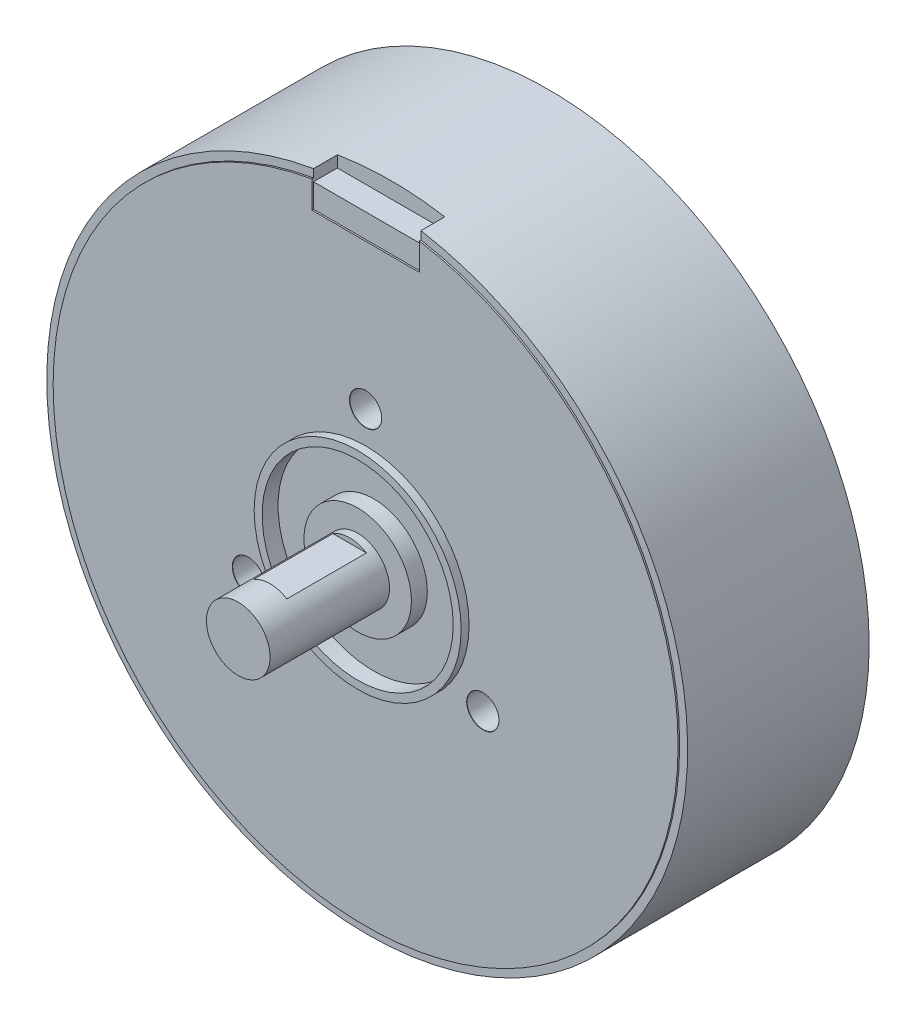
ISO-10303-21;
HEADER;
FILE_DESCRIPTION(('STEP AP214'),'2;1');
FILE_NAME('part.step','',(''),(''),'','','');
FILE_SCHEMA(('AUTOMOTIVE_DESIGN { 1 0 10303 214 1 1 1 1 }'));
ENDSEC;
DATA;
#1=APPLICATION_CONTEXT('core data for automotive mechanical design processes');
#2=APPLICATION_PROTOCOL_DEFINITION('international standard','automotive_design',2000,#1);
#3=PRODUCT_CONTEXT('',#1,'mechanical');
#4=PRODUCT('Part','Part','',(#3));
#5=PRODUCT_RELATED_PRODUCT_CATEGORY('part','',(#4));
#6=PRODUCT_DEFINITION_FORMATION('','',#4);
#7=PRODUCT_DEFINITION_CONTEXT('part definition',#1,'design');
#8=PRODUCT_DEFINITION('design','',#6,#7);
#9=PRODUCT_DEFINITION_SHAPE('','',#8);
#10=(LENGTH_UNIT() NAMED_UNIT(*) SI_UNIT(.MILLI.,.METRE.));
#11=(NAMED_UNIT(*) PLANE_ANGLE_UNIT() SI_UNIT($,.RADIAN.));
#12=(NAMED_UNIT(*) SI_UNIT($,.STERADIAN.) SOLID_ANGLE_UNIT());
#13=UNCERTAINTY_MEASURE_WITH_UNIT(LENGTH_MEASURE(1.E-05),#10,'distance_accuracy_value','');
#14=(GEOMETRIC_REPRESENTATION_CONTEXT(3) GLOBAL_UNCERTAINTY_ASSIGNED_CONTEXT((#13)) GLOBAL_UNIT_ASSIGNED_CONTEXT((#10,
#11,#12)) REPRESENTATION_CONTEXT('',''));
#15=CARTESIAN_POINT('',(0.,0.,0.));
#16=DIRECTION('',(0.,0.,1.));
#17=DIRECTION('',(1.,0.,0.));
#18=AXIS2_PLACEMENT_3D('',#15,#16,#17);
#19=CARTESIAN_POINT('',(0.,0.,22.8));
#20=DIRECTION('',(0.,0.,1.));
#21=DIRECTION('',(1.,0.,0.));
#22=AXIS2_PLACEMENT_3D('',#19,#20,#21);
#23=PLANE('',#22);
#24=CARTESIAN_POINT('',(0.,0.,22.8));
#25=DIRECTION('',(0.,0.,1.));
#26=DIRECTION('',(1.,0.,0.));
#27=AXIS2_PLACEMENT_3D('',#24,#25,#26);
#28=CIRCLE('',#27,39.25);
#29=CARTESIAN_POINT('',(-6.75,38.6652298583624,22.8));
#30=VERTEX_POINT('',#29);
#31=CARTESIAN_POINT('',(6.75,38.6652298583624,22.8));
#32=VERTEX_POINT('',#31);
#33=EDGE_CURVE('E242',#30,#32,#28,.T.);
#34=ORIENTED_EDGE('',*,*,#33,.F.);
#35=DIRECTION('',(0.,1.,0.));
#36=VECTOR('',#35,1.);
#37=CARTESIAN_POINT('',(-6.75,0.,22.8));
#38=LINE('',#37,#36);
#39=CARTESIAN_POINT('',(-6.75,39.679969758053,22.8));
#40=VERTEX_POINT('',#39);
#41=EDGE_CURVE('E208',#30,#40,#38,.T.);
#42=ORIENTED_EDGE('',*,*,#41,.T.);
#43=CARTESIAN_POINT('',(0.,0.,22.8));
#44=DIRECTION('',(0.,0.,1.));
#45=DIRECTION('',(1.,0.,0.));
#46=AXIS2_PLACEMENT_3D('',#43,#44,#45);
#47=CIRCLE('',#46,40.25);
#48=CARTESIAN_POINT('',(6.75,39.679969758053,22.8));
#49=VERTEX_POINT('',#48);
#50=EDGE_CURVE('E245',#40,#49,#47,.T.);
#51=ORIENTED_EDGE('',*,*,#50,.T.);
#52=DIRECTION('',(0.,1.,0.));
#53=VECTOR('',#52,1.);
#54=CARTESIAN_POINT('',(6.75,0.,22.8));
#55=LINE('',#54,#53);
#56=EDGE_CURVE('E197',#32,#49,#55,.T.);
#57=ORIENTED_EDGE('',*,*,#56,.F.);
#58=EDGE_LOOP('',(#34,#42,#51,#57));
#59=FACE_BOUND('',#58,.T.);
#60=ADVANCED_FACE('F66',(#59),#23,.T.);
#61=DIRECTION('',(0.,1.,0.));
#62=VECTOR('',#61,1.);
#63=CARTESIAN_POINT('',(6.75,0.,22.8));
#64=LINE('',#63,#62);
#65=CARTESIAN_POINT('',(6.75,35.25,22.8));
#66=VERTEX_POINT('',#65);
#67=CARTESIAN_POINT('',(6.75,38.25,22.8));
#68=VERTEX_POINT('',#67);
#69=EDGE_CURVE('E219',#66,#68,#64,.T.);
#70=ORIENTED_EDGE('',*,*,#69,.T.);
#71=DIRECTION('',(-1.,0.,0.));
#72=VECTOR('',#71,1.);
#73=CARTESIAN_POINT('',(0.,38.25,22.8));
#74=LINE('',#73,#72);
#75=CARTESIAN_POINT('',(-6.75,38.25,22.8));
#76=VERTEX_POINT('',#75);
#77=EDGE_CURVE('E81',#68,#76,#74,.T.);
#78=ORIENTED_EDGE('',*,*,#77,.T.);
#79=DIRECTION('',(0.,1.,0.));
#80=VECTOR('',#79,1.);
#81=CARTESIAN_POINT('',(-6.75,0.,22.8));
#82=LINE('',#81,#80);
#83=CARTESIAN_POINT('',(-6.75,35.25,22.8));
#84=VERTEX_POINT('',#83);
#85=EDGE_CURVE('E223',#84,#76,#82,.T.);
#86=ORIENTED_EDGE('',*,*,#85,.F.);
#87=DIRECTION('',(1.,0.,0.));
#88=VECTOR('',#87,1.);
#89=CARTESIAN_POINT('',(0.,35.25,22.8));
#90=LINE('',#89,#88);
#91=EDGE_CURVE('E216',#84,#66,#90,.T.);
#92=ORIENTED_EDGE('',*,*,#91,.T.);
#93=EDGE_LOOP('',(#70,#78,#86,#92));
#94=FACE_BOUND('',#93,.T.);
#95=ADVANCED_FACE('F329',(#94),#23,.T.);
#96=CARTESIAN_POINT('',(0.,0.,23.));
#97=DIRECTION('',(0.,0.,-1.));
#98=DIRECTION('',(-1.,0.,0.));
#99=AXIS2_PLACEMENT_3D('',#96,#97,#98);
#100=CYLINDRICAL_SURFACE('',#99,40.25);
#101=CARTESIAN_POINT('',(0.,0.,0.));
#102=DIRECTION('',(0.,0.,1.));
#103=DIRECTION('',(1.,0.,0.));
#104=AXIS2_PLACEMENT_3D('',#101,#102,#103);
#105=CIRCLE('',#104,40.25);
#106=CARTESIAN_POINT('',(40.25,0.,0.));
#107=VERTEX_POINT('',#106);
#108=EDGE_CURVE('E281',#107,#107,#105,.T.);
#109=ORIENTED_EDGE('',*,*,#108,.T.);
#110=EDGE_LOOP('',(#109));
#111=FACE_BOUND('',#110,.T.);
#112=CARTESIAN_POINT('',(0.,0.,19.8));
#113=DIRECTION('',(0.,0.,1.));
#114=DIRECTION('',(1.,0.,0.));
#115=AXIS2_PLACEMENT_3D('',#112,#113,#114);
#116=CIRCLE('',#115,40.25);
#117=CARTESIAN_POINT('',(6.75,39.679969758053,19.8));
#118=VERTEX_POINT('',#117);
#119=CARTESIAN_POINT('',(-6.75,39.679969758053,19.8));
#120=VERTEX_POINT('',#119);
#121=EDGE_CURVE('E305',#118,#120,#116,.T.);
#122=ORIENTED_EDGE('',*,*,#121,.F.);
#123=DIRECTION('',(0.,0.,-1.));
#124=VECTOR('',#123,1.);
#125=CARTESIAN_POINT('',(6.75,39.679969758053,23.));
#126=LINE('',#125,#124);
#127=EDGE_CURVE('E12',#118,#49,#126,.F.);
#128=ORIENTED_EDGE('',*,*,#127,.T.);
#129=ORIENTED_EDGE('',*,*,#50,.F.);
#130=DIRECTION('',(0.,0.,-1.));
#131=VECTOR('',#130,1.);
#132=CARTESIAN_POINT('',(-6.75,39.679969758053,23.));
#133=LINE('',#132,#131);
#134=EDGE_CURVE('E74',#120,#40,#133,.F.);
#135=ORIENTED_EDGE('',*,*,#134,.F.);
#136=EDGE_LOOP('',(#122,#128,#129,#135));
#137=FACE_BOUND('',#136,.T.);
#138=ADVANCED_FACE('F68',(#111,#137),#100,.T.);
#139=CARTESIAN_POINT('',(0.,0.,23.));
#140=DIRECTION('',(0.,0.,1.));
#141=DIRECTION('',(1.,0.,0.));
#142=AXIS2_PLACEMENT_3D('',#139,#140,#141);
#143=PLANE('',#142);
#144=CARTESIAN_POINT('',(0.,17.,23.));
#145=DIRECTION('',(0.,0.,1.));
#146=DIRECTION('',(1.,0.,0.));
#147=AXIS2_PLACEMENT_3D('',#144,#145,#146);
#148=CIRCLE('',#147,2.025);
#149=CARTESIAN_POINT('',(2.025,17.,23.));
#150=VERTEX_POINT('',#149);
#151=EDGE_CURVE('E179',#150,#150,#148,.T.);
#152=ORIENTED_EDGE('',*,*,#151,.F.);
#153=EDGE_LOOP('',(#152));
#154=FACE_BOUND('',#153,.T.);
#155=CARTESIAN_POINT('',(14.7224318643355,-8.49999999999996,23.));
#156=DIRECTION('',(0.,0.,1.));
#157=DIRECTION('',(1.,0.,0.));
#158=AXIS2_PLACEMENT_3D('',#155,#156,#157);
#159=CIRCLE('',#158,2.025);
#160=CARTESIAN_POINT('',(16.7474318643355,-8.49999999999996,23.));
#161=VERTEX_POINT('',#160);
#162=EDGE_CURVE('E172',#161,#161,#159,.T.);
#163=ORIENTED_EDGE('',*,*,#162,.F.);
#164=EDGE_LOOP('',(#163));
#165=FACE_BOUND('',#164,.T.);
#166=CARTESIAN_POINT('',(-14.7224318643355,-8.49999999999997,23.));
#167=DIRECTION('',(0.,0.,1.));
#168=DIRECTION('',(1.,0.,0.));
#169=AXIS2_PLACEMENT_3D('',#166,#167,#168);
#170=CIRCLE('',#169,2.025);
#171=CARTESIAN_POINT('',(-12.6974318643355,-8.49999999999997,23.));
#172=VERTEX_POINT('',#171);
#173=EDGE_CURVE('E188',#172,#172,#170,.T.);
#174=ORIENTED_EDGE('',*,*,#173,.F.);
#175=EDGE_LOOP('',(#174));
#176=FACE_BOUND('',#175,.T.);
#177=CARTESIAN_POINT('',(0.,0.,23.));
#178=DIRECTION('',(0.,0.,1.));
#179=DIRECTION('',(1.,0.,0.));
#180=AXIS2_PLACEMENT_3D('',#177,#178,#179);
#181=CIRCLE('',#180,13.);
#182=CARTESIAN_POINT('',(13.,0.,23.));
#183=VERTEX_POINT('',#182);
#184=EDGE_CURVE('E290',#183,#183,#181,.T.);
#185=ORIENTED_EDGE('',*,*,#184,.F.);
#186=EDGE_LOOP('',(#185));
#187=FACE_BOUND('',#186,.T.);
#188=DIRECTION('',(1.,0.,0.));
#189=VECTOR('',#188,1.);
#190=CARTESIAN_POINT('',(0.,35.25,23.));
#191=LINE('',#190,#189);
#192=CARTESIAN_POINT('',(-6.75,35.25,23.));
#193=VERTEX_POINT('',#192);
#194=CARTESIAN_POINT('',(6.75,35.25,23.));
#195=VERTEX_POINT('',#194);
#196=EDGE_CURVE('E214',#193,#195,#191,.T.);
#197=ORIENTED_EDGE('',*,*,#196,.F.);
#198=DIRECTION('',(0.,1.,0.));
#199=VECTOR('',#198,1.);
#200=CARTESIAN_POINT('',(-6.75,0.,23.));
#201=LINE('',#200,#199);
#202=CARTESIAN_POINT('',(-6.75,38.6652298583624,23.));
#203=VERTEX_POINT('',#202);
#204=EDGE_CURVE('E220',#193,#203,#201,.T.);
#205=ORIENTED_EDGE('',*,*,#204,.T.);
#206=CARTESIAN_POINT('',(0.,0.,23.));
#207=DIRECTION('',(0.,0.,1.));
#208=DIRECTION('',(1.,0.,0.));
#209=AXIS2_PLACEMENT_3D('',#206,#207,#208);
#210=CIRCLE('',#209,39.25);
#211=CARTESIAN_POINT('',(6.75,38.6652298583624,23.));
#212=VERTEX_POINT('',#211);
#213=EDGE_CURVE('E235',#203,#212,#210,.T.);
#214=ORIENTED_EDGE('',*,*,#213,.T.);
#215=DIRECTION('',(0.,1.,0.));
#216=VECTOR('',#215,1.);
#217=CARTESIAN_POINT('',(6.75,0.,23.));
#218=LINE('',#217,#216);
#219=EDGE_CURVE('E229',#195,#212,#218,.T.);
#220=ORIENTED_EDGE('',*,*,#219,.F.);
#221=EDGE_LOOP('',(#197,#205,#214,#220));
#222=FACE_BOUND('',#221,.T.);
#223=ADVANCED_FACE('F339',(#154,#165,#176,#187,#222),#143,.T.);
#224=CARTESIAN_POINT('',(0.,0.,22.8));
#225=DIRECTION('',(0.,0.,1.));
#226=DIRECTION('',(1.,0.,0.));
#227=AXIS2_PLACEMENT_3D('',#224,#225,#226);
#228=CYLINDRICAL_SURFACE('',#227,39.25);
#229=ORIENTED_EDGE('',*,*,#213,.F.);
#230=DIRECTION('',(0.,0.,1.));
#231=VECTOR('',#230,1.);
#232=CARTESIAN_POINT('',(-6.75,38.6652298583624,22.8));
#233=LINE('',#232,#231);
#234=EDGE_CURVE('E236',#30,#203,#233,.T.);
#235=ORIENTED_EDGE('',*,*,#234,.F.);
#236=ORIENTED_EDGE('',*,*,#33,.T.);
#237=DIRECTION('',(0.,0.,1.));
#238=VECTOR('',#237,1.);
#239=CARTESIAN_POINT('',(6.75,38.6652298583624,22.8));
#240=LINE('',#239,#238);
#241=EDGE_CURVE('E238',#32,#212,#240,.T.);
#242=ORIENTED_EDGE('',*,*,#241,.T.);
#243=EDGE_LOOP('',(#229,#235,#236,#242));
#244=FACE_BOUND('',#243,.T.);
#245=ADVANCED_FACE('F338',(#244),#228,.T.);
#246=CARTESIAN_POINT('',(0.,0.,25.));
#247=DIRECTION('',(0.,0.,1.));
#248=DIRECTION('',(1.,0.,0.));
#249=AXIS2_PLACEMENT_3D('',#246,#247,#248);
#250=PLANE('',#249);
#251=CARTESIAN_POINT('',(0.,0.,25.));
#252=DIRECTION('',(0.,0.,1.));
#253=DIRECTION('',(1.,0.,0.));
#254=AXIS2_PLACEMENT_3D('',#251,#252,#253);
#255=CIRCLE('',#254,4.);
#256=CARTESIAN_POINT('',(-3.4,2.10713075057055,25.));
#257=VERTEX_POINT('',#256);
#258=CARTESIAN_POINT('',(-3.4,-2.10713075057055,25.));
#259=VERTEX_POINT('',#258);
#260=EDGE_CURVE('E272',#257,#259,#255,.T.);
#261=ORIENTED_EDGE('',*,*,#260,.T.);
#262=DIRECTION('',(0.,1.,0.));
#263=VECTOR('',#262,1.);
#264=CARTESIAN_POINT('',(-3.4,0.,25.));
#265=LINE('',#264,#263);
#266=EDGE_CURVE('E302',#259,#257,#265,.T.);
#267=ORIENTED_EDGE('',*,*,#266,.T.);
#268=EDGE_LOOP('',(#261,#267));
#269=FACE_BOUND('',#268,.T.);
#270=ADVANCED_FACE('F347',(#269),#250,.T.);
#271=CARTESIAN_POINT('',(2.10713075057055,3.4,25.));
#272=VERTEX_POINT('',#271);
#273=CARTESIAN_POINT('',(-2.10713075057055,3.4,25.));
#274=VERTEX_POINT('',#273);
#275=EDGE_CURVE('E273',#272,#274,#255,.T.);
#276=ORIENTED_EDGE('',*,*,#275,.T.);
#277=DIRECTION('',(1.,0.,0.));
#278=VECTOR('',#277,1.);
#279=CARTESIAN_POINT('',(0.,3.4,25.));
#280=LINE('',#279,#278);
#281=EDGE_CURVE('E280',#274,#272,#280,.T.);
#282=ORIENTED_EDGE('',*,*,#281,.T.);
#283=EDGE_LOOP('',(#276,#282));
#284=FACE_BOUND('',#283,.T.);
#285=ADVANCED_FACE('F381',(#284),#250,.T.);
#286=CARTESIAN_POINT('',(0.,0.,24.));
#287=DIRECTION('',(0.,0.,1.));
#288=DIRECTION('',(1.,0.,0.));
#289=AXIS2_PLACEMENT_3D('',#286,#287,#288);
#290=PLANE('',#289);
#291=CARTESIAN_POINT('',(0.,0.,24.));
#292=DIRECTION('',(0.,0.,1.));
#293=DIRECTION('',(1.,0.,0.));
#294=AXIS2_PLACEMENT_3D('',#291,#292,#293);
#295=CIRCLE('',#294,13.);
#296=CARTESIAN_POINT('',(13.,0.,24.));
#297=VERTEX_POINT('',#296);
#298=EDGE_CURVE('E291',#297,#297,#295,.T.);
#299=ORIENTED_EDGE('',*,*,#298,.T.);
#300=EDGE_LOOP('',(#299));
#301=FACE_BOUND('',#300,.T.);
#302=CARTESIAN_POINT('',(0.,0.,24.));
#303=DIRECTION('',(0.,0.,1.));
#304=DIRECTION('',(1.,0.,0.));
#305=AXIS2_PLACEMENT_3D('',#302,#303,#304);
#306=CIRCLE('',#305,12.);
#307=CARTESIAN_POINT('',(12.,0.,24.));
#308=VERTEX_POINT('',#307);
#309=EDGE_CURVE('E285',#308,#308,#306,.T.);
#310=ORIENTED_EDGE('',*,*,#309,.F.);
#311=EDGE_LOOP('',(#310));
#312=FACE_BOUND('',#311,.T.);
#313=ADVANCED_FACE('F395',(#301,#312),#290,.T.);
#314=CARTESIAN_POINT('',(0.,0.,24.));
#315=DIRECTION('',(0.,0.,-1.));
#316=DIRECTION('',(-1.,0.,0.));
#317=AXIS2_PLACEMENT_3D('',#314,#315,#316);
#318=CYLINDRICAL_SURFACE('',#317,13.);
#319=ORIENTED_EDGE('',*,*,#298,.F.);
#320=EDGE_LOOP('',(#319));
#321=FACE_BOUND('',#320,.T.);
#322=ORIENTED_EDGE('',*,*,#184,.T.);
#323=EDGE_LOOP('',(#322));
#324=FACE_BOUND('',#323,.T.);
#325=ADVANCED_FACE('F398',(#321,#324),#318,.T.);
#326=CARTESIAN_POINT('',(0.,0.,22.));
#327=DIRECTION('',(0.,0.,1.));
#328=DIRECTION('',(1.,0.,0.));
#329=AXIS2_PLACEMENT_3D('',#326,#327,#328);
#330=PLANE('',#329);
#331=CARTESIAN_POINT('',(0.,0.,22.));
#332=DIRECTION('',(0.,0.,1.));
#333=DIRECTION('',(1.,0.,0.));
#334=AXIS2_PLACEMENT_3D('',#331,#332,#333);
#335=CIRCLE('',#334,6.75);
#336=CARTESIAN_POINT('',(6.75,0.,22.));
#337=VERTEX_POINT('',#336);
#338=EDGE_CURVE('E276',#337,#337,#335,.T.);
#339=ORIENTED_EDGE('',*,*,#338,.F.);
#340=EDGE_LOOP('',(#339));
#341=FACE_BOUND('',#340,.T.);
#342=CARTESIAN_POINT('',(0.,0.,22.));
#343=DIRECTION('',(0.,0.,1.));
#344=DIRECTION('',(1.,0.,0.));
#345=AXIS2_PLACEMENT_3D('',#342,#343,#344);
#346=CIRCLE('',#345,12.);
#347=CARTESIAN_POINT('',(12.,0.,22.));
#348=VERTEX_POINT('',#347);
#349=EDGE_CURVE('E294',#348,#348,#346,.T.);
#350=ORIENTED_EDGE('',*,*,#349,.T.);
#351=EDGE_LOOP('',(#350));
#352=FACE_BOUND('',#351,.T.);
#353=ADVANCED_FACE('F402',(#341,#352),#330,.T.);
#354=CARTESIAN_POINT('',(0.,0.,22.));
#355=DIRECTION('',(0.,0.,1.));
#356=DIRECTION('',(1.,0.,0.));
#357=AXIS2_PLACEMENT_3D('',#354,#355,#356);
#358=CYLINDRICAL_SURFACE('',#357,12.);
#359=ORIENTED_EDGE('',*,*,#349,.F.);
#360=EDGE_LOOP('',(#359));
#361=FACE_BOUND('',#360,.T.);
#362=ORIENTED_EDGE('',*,*,#309,.T.);
#363=EDGE_LOOP('',(#362));
#364=FACE_BOUND('',#363,.T.);
#365=ADVANCED_FACE('F393',(#361,#364),#358,.F.);
#366=CARTESIAN_POINT('',(0.,0.,24.));
#367=DIRECTION('',(0.,0.,-1.));
#368=DIRECTION('',(-1.,0.,0.));
#369=AXIS2_PLACEMENT_3D('',#366,#367,#368);
#370=CYLINDRICAL_SURFACE('',#369,6.75);
#371=CARTESIAN_POINT('',(0.,0.,24.));
#372=DIRECTION('',(0.,0.,1.));
#373=DIRECTION('',(1.,0.,0.));
#374=AXIS2_PLACEMENT_3D('',#371,#372,#373);
#375=CIRCLE('',#374,6.75);
#376=CARTESIAN_POINT('',(6.75,0.,24.));
#377=VERTEX_POINT('',#376);
#378=EDGE_CURVE('E282',#377,#377,#375,.T.);
#379=ORIENTED_EDGE('',*,*,#378,.F.);
#380=EDGE_LOOP('',(#379));
#381=FACE_BOUND('',#380,.T.);
#382=ORIENTED_EDGE('',*,*,#338,.T.);
#383=EDGE_LOOP('',(#382));
#384=FACE_BOUND('',#383,.T.);
#385=ADVANCED_FACE('F389',(#381,#384),#370,.T.);
#386=CARTESIAN_POINT('',(0.,0.,24.));
#387=DIRECTION('',(0.,0.,1.));
#388=DIRECTION('',(1.,0.,0.));
#389=AXIS2_PLACEMENT_3D('',#386,#387,#388);
#390=PLANE('',#389);
#391=CARTESIAN_POINT('',(0.,0.,24.));
#392=DIRECTION('',(0.,0.,1.));
#393=DIRECTION('',(1.,0.,0.));
#394=AXIS2_PLACEMENT_3D('',#391,#392,#393);
#395=CIRCLE('',#394,4.);
#396=CARTESIAN_POINT('',(4.,0.,24.));
#397=VERTEX_POINT('',#396);
#398=EDGE_CURVE('E277',#397,#397,#395,.T.);
#399=ORIENTED_EDGE('',*,*,#398,.F.);
#400=EDGE_LOOP('',(#399));
#401=FACE_BOUND('',#400,.T.);
#402=ORIENTED_EDGE('',*,*,#378,.T.);
#403=EDGE_LOOP('',(#402));
#404=FACE_BOUND('',#403,.T.);
#405=ADVANCED_FACE('F385',(#401,#404),#390,.T.);
#406=CARTESIAN_POINT('',(0.,0.,25.));
#407=DIRECTION('',(0.,0.,-1.));
#408=DIRECTION('',(-1.,0.,0.));
#409=AXIS2_PLACEMENT_3D('',#406,#407,#408);
#410=CYLINDRICAL_SURFACE('',#409,4.);
#411=DIRECTION('',(0.,0.,-1.));
#412=VECTOR('',#411,1.);
#413=CARTESIAN_POINT('',(-3.4,2.10713075057055,35.));
#414=LINE('',#413,#412);
#415=CARTESIAN_POINT('',(-3.4,2.10713075057055,35.));
#416=VERTEX_POINT('',#415);
#417=EDGE_CURVE('E270',#416,#257,#414,.T.);
#418=ORIENTED_EDGE('',*,*,#417,.F.);
#419=CARTESIAN_POINT('',(0.,0.,35.));
#420=DIRECTION('',(0.,0.,1.));
#421=DIRECTION('',(1.,0.,0.));
#422=AXIS2_PLACEMENT_3D('',#419,#420,#421);
#423=CIRCLE('',#422,4.);
#424=CARTESIAN_POINT('',(-3.4,-2.10713075057055,35.));
#425=VERTEX_POINT('',#424);
#426=EDGE_CURVE('E250',#416,#425,#423,.T.);
#427=ORIENTED_EDGE('',*,*,#426,.T.);
#428=DIRECTION('',(0.,0.,-1.));
#429=VECTOR('',#428,1.);
#430=CARTESIAN_POINT('',(-3.4,-2.10713075057055,35.));
#431=LINE('',#430,#429);
#432=EDGE_CURVE('E267',#425,#259,#431,.T.);
#433=ORIENTED_EDGE('',*,*,#432,.T.);
#434=ORIENTED_EDGE('',*,*,#260,.F.);
#435=EDGE_LOOP('',(#418,#427,#433,#434));
#436=FACE_BOUND('',#435,.T.);
#437=ORIENTED_EDGE('',*,*,#398,.T.);
#438=EDGE_LOOP('',(#437));
#439=FACE_BOUND('',#438,.T.);
#440=CARTESIAN_POINT('',(2.10713075057055,3.4,35.));
#441=VERTEX_POINT('',#440);
#442=CARTESIAN_POINT('',(-2.10713075057055,3.4,35.));
#443=VERTEX_POINT('',#442);
#444=EDGE_CURVE('E255',#441,#443,#423,.T.);
#445=ORIENTED_EDGE('',*,*,#444,.T.);
#446=DIRECTION('',(0.,0.,-1.));
#447=VECTOR('',#446,1.);
#448=CARTESIAN_POINT('',(-2.10713075057055,3.4,35.));
#449=LINE('',#448,#447);
#450=EDGE_CURVE('E263',#443,#274,#449,.T.);
#451=ORIENTED_EDGE('',*,*,#450,.T.);
#452=ORIENTED_EDGE('',*,*,#275,.F.);
#453=DIRECTION('',(0.,0.,-1.));
#454=VECTOR('',#453,1.);
#455=CARTESIAN_POINT('',(2.10713075057055,3.4,35.));
#456=LINE('',#455,#454);
#457=EDGE_CURVE('E89',#441,#272,#456,.T.);
#458=ORIENTED_EDGE('',*,*,#457,.F.);
#459=EDGE_LOOP('',(#445,#451,#452,#458));
#460=FACE_BOUND('',#459,.T.);
#461=CARTESIAN_POINT('',(0.,0.,39.));
#462=DIRECTION('',(0.,0.,1.));
#463=DIRECTION('',(1.,0.,0.));
#464=AXIS2_PLACEMENT_3D('',#461,#462,#463);
#465=CIRCLE('',#464,4.);
#466=CARTESIAN_POINT('',(4.,0.,39.));
#467=VERTEX_POINT('',#466);
#468=EDGE_CURVE('E251',#467,#467,#465,.T.);
#469=ORIENTED_EDGE('',*,*,#468,.F.);
#470=EDGE_LOOP('',(#469));
#471=FACE_BOUND('',#470,.T.);
#472=ADVANCED_FACE('F377',(#436,#439,#460,#471),#410,.T.);
#473=CARTESIAN_POINT('',(-3.4,0.,35.));
#474=DIRECTION('',(1.,0.,0.));
#475=DIRECTION('',(0.,0.,-1.));
#476=AXIS2_PLACEMENT_3D('',#473,#474,#475);
#477=PLANE('',#476);
#478=ORIENTED_EDGE('',*,*,#266,.F.);
#479=ORIENTED_EDGE('',*,*,#432,.F.);
#480=DIRECTION('',(0.,-1.,0.));
#481=VECTOR('',#480,1.);
#482=CARTESIAN_POINT('',(-3.4,0.,35.));
#483=LINE('',#482,#481);
#484=EDGE_CURVE('E254',#416,#425,#483,.T.);
#485=ORIENTED_EDGE('',*,*,#484,.F.);
#486=ORIENTED_EDGE('',*,*,#417,.T.);
#487=EDGE_LOOP('',(#478,#479,#485,#486));
#488=FACE_BOUND('',#487,.T.);
#489=ADVANCED_FACE('F374',(#488),#477,.F.);
#490=CARTESIAN_POINT('',(0.,3.4,35.));
#491=DIRECTION('',(0.,-1.,0.));
#492=DIRECTION('',(0.,0.,-1.));
#493=AXIS2_PLACEMENT_3D('',#490,#491,#492);
#494=PLANE('',#493);
#495=ORIENTED_EDGE('',*,*,#281,.F.);
#496=ORIENTED_EDGE('',*,*,#450,.F.);
#497=DIRECTION('',(-1.,0.,0.));
#498=VECTOR('',#497,1.);
#499=CARTESIAN_POINT('',(0.,3.4,35.));
#500=LINE('',#499,#498);
#501=EDGE_CURVE('E260',#441,#443,#500,.T.);
#502=ORIENTED_EDGE('',*,*,#501,.F.);
#503=ORIENTED_EDGE('',*,*,#457,.T.);
#504=EDGE_LOOP('',(#495,#496,#502,#503));
#505=FACE_BOUND('',#504,.T.);
#506=ADVANCED_FACE('F370',(#505),#494,.F.);
#507=CARTESIAN_POINT('',(0.,0.,35.));
#508=DIRECTION('',(0.,0.,1.));
#509=DIRECTION('',(1.,0.,0.));
#510=AXIS2_PLACEMENT_3D('',#507,#508,#509);
#511=PLANE('',#510);
#512=ORIENTED_EDGE('',*,*,#426,.F.);
#513=ORIENTED_EDGE('',*,*,#484,.T.);
#514=EDGE_LOOP('',(#512,#513));
#515=FACE_BOUND('',#514,.T.);
#516=ADVANCED_FACE('F367',(#515),#511,.F.);
#517=ORIENTED_EDGE('',*,*,#444,.F.);
#518=ORIENTED_EDGE('',*,*,#501,.T.);
#519=EDGE_LOOP('',(#517,#518));
#520=FACE_BOUND('',#519,.T.);
#521=ADVANCED_FACE('F365',(#520),#511,.F.);
#522=CARTESIAN_POINT('',(0.,0.,39.));
#523=DIRECTION('',(0.,0.,1.));
#524=DIRECTION('',(1.,0.,0.));
#525=AXIS2_PLACEMENT_3D('',#522,#523,#524);
#526=PLANE('',#525);
#527=ORIENTED_EDGE('',*,*,#468,.T.);
#528=EDGE_LOOP('',(#527));
#529=FACE_BOUND('',#528,.T.);
#530=ADVANCED_FACE('F361',(#529),#526,.T.);
#531=CARTESIAN_POINT('',(0.,0.,0.));
#532=DIRECTION('',(0.,0.,1.));
#533=DIRECTION('',(1.,0.,0.));
#534=AXIS2_PLACEMENT_3D('',#531,#532,#533);
#535=PLANE('',#534);
#536=ORIENTED_EDGE('',*,*,#108,.F.);
#537=EDGE_LOOP('',(#536));
#538=FACE_BOUND('',#537,.T.);
#539=ADVANCED_FACE('F364',(#538),#535,.F.);
#540=CARTESIAN_POINT('',(0.,35.25,22.8));
#541=DIRECTION('',(0.,-1.,0.));
#542=DIRECTION('',(0.,0.,-1.));
#543=AXIS2_PLACEMENT_3D('',#540,#541,#542);
#544=PLANE('',#543);
#545=ORIENTED_EDGE('',*,*,#196,.T.);
#546=DIRECTION('',(0.,0.,1.));
#547=VECTOR('',#546,1.);
#548=CARTESIAN_POINT('',(6.75,35.25,22.8));
#549=LINE('',#548,#547);
#550=EDGE_CURVE('E226',#66,#195,#549,.T.);
#551=ORIENTED_EDGE('',*,*,#550,.F.);
#552=ORIENTED_EDGE('',*,*,#91,.F.);
#553=DIRECTION('',(0.,0.,1.));
#554=VECTOR('',#553,1.);
#555=CARTESIAN_POINT('',(-6.75,35.25,22.8));
#556=LINE('',#555,#554);
#557=EDGE_CURVE('E233',#84,#193,#556,.T.);
#558=ORIENTED_EDGE('',*,*,#557,.T.);
#559=EDGE_LOOP('',(#545,#551,#552,#558));
#560=FACE_BOUND('',#559,.T.);
#561=ADVANCED_FACE('F331',(#560),#544,.F.);
#562=CARTESIAN_POINT('',(-6.75,0.,22.8));
#563=DIRECTION('',(1.,0.,0.));
#564=DIRECTION('',(0.,0.,-1.));
#565=AXIS2_PLACEMENT_3D('',#562,#563,#564);
#566=PLANE('',#565);
#567=ORIENTED_EDGE('',*,*,#204,.F.);
#568=ORIENTED_EDGE('',*,*,#557,.F.);
#569=ORIENTED_EDGE('',*,*,#85,.T.);
#570=DIRECTION('',(0.,0.,1.));
#571=VECTOR('',#570,1.);
#572=CARTESIAN_POINT('',(-6.75,38.25,19.8));
#573=LINE('',#572,#571);
#574=CARTESIAN_POINT('',(-6.75,38.25,19.8));
#575=VERTEX_POINT('',#574);
#576=EDGE_CURVE('E206',#575,#76,#573,.T.);
#577=ORIENTED_EDGE('',*,*,#576,.F.);
#578=DIRECTION('',(0.,1.,0.));
#579=VECTOR('',#578,1.);
#580=CARTESIAN_POINT('',(-6.75,0.,19.8));
#581=LINE('',#580,#579);
#582=EDGE_CURVE('E201',#575,#120,#581,.T.);
#583=ORIENTED_EDGE('',*,*,#582,.T.);
#584=ORIENTED_EDGE('',*,*,#134,.T.);
#585=ORIENTED_EDGE('',*,*,#41,.F.);
#586=ORIENTED_EDGE('',*,*,#234,.T.);
#587=EDGE_LOOP('',(#567,#568,#569,#577,#583,#584,#585,#586));
#588=FACE_BOUND('',#587,.T.);
#589=ADVANCED_FACE('F309',(#588),#566,.T.);
#590=CARTESIAN_POINT('',(6.75,0.,22.8));
#591=DIRECTION('',(1.,0.,0.));
#592=DIRECTION('',(0.,0.,-1.));
#593=AXIS2_PLACEMENT_3D('',#590,#591,#592);
#594=PLANE('',#593);
#595=ORIENTED_EDGE('',*,*,#219,.T.);
#596=ORIENTED_EDGE('',*,*,#241,.F.);
#597=ORIENTED_EDGE('',*,*,#56,.T.);
#598=ORIENTED_EDGE('',*,*,#127,.F.);
#599=DIRECTION('',(0.,1.,0.));
#600=VECTOR('',#599,1.);
#601=CARTESIAN_POINT('',(6.75,0.,19.8));
#602=LINE('',#601,#600);
#603=CARTESIAN_POINT('',(6.75,38.25,19.8));
#604=VERTEX_POINT('',#603);
#605=EDGE_CURVE('E198',#604,#118,#602,.T.);
#606=ORIENTED_EDGE('',*,*,#605,.F.);
#607=DIRECTION('',(0.,0.,1.));
#608=VECTOR('',#607,1.);
#609=CARTESIAN_POINT('',(6.75,38.25,19.8));
#610=LINE('',#609,#608);
#611=EDGE_CURVE('E212',#604,#68,#610,.T.);
#612=ORIENTED_EDGE('',*,*,#611,.T.);
#613=ORIENTED_EDGE('',*,*,#69,.F.);
#614=ORIENTED_EDGE('',*,*,#550,.T.);
#615=EDGE_LOOP('',(#595,#596,#597,#598,#606,#612,#613,#614));
#616=FACE_BOUND('',#615,.T.);
#617=ADVANCED_FACE('F320',(#616),#594,.F.);
#618=CARTESIAN_POINT('',(0.,0.,19.8));
#619=DIRECTION('',(0.,0.,1.));
#620=DIRECTION('',(1.,0.,0.));
#621=AXIS2_PLACEMENT_3D('',#618,#619,#620);
#622=PLANE('',#621);
#623=ORIENTED_EDGE('',*,*,#605,.T.);
#624=ORIENTED_EDGE('',*,*,#121,.T.);
#625=ORIENTED_EDGE('',*,*,#582,.F.);
#626=DIRECTION('',(-1.,0.,0.));
#627=VECTOR('',#626,1.);
#628=CARTESIAN_POINT('',(0.,38.25,19.8));
#629=LINE('',#628,#627);
#630=EDGE_CURVE('E204',#604,#575,#629,.T.);
#631=ORIENTED_EDGE('',*,*,#630,.F.);
#632=EDGE_LOOP('',(#623,#624,#625,#631));
#633=FACE_BOUND('',#632,.T.);
#634=ADVANCED_FACE('F324',(#633),#622,.T.);
#635=CARTESIAN_POINT('',(0.,38.25,19.8));
#636=DIRECTION('',(0.,1.,0.));
#637=DIRECTION('',(0.,0.,1.));
#638=AXIS2_PLACEMENT_3D('',#635,#636,#637);
#639=PLANE('',#638);
#640=ORIENTED_EDGE('',*,*,#77,.F.);
#641=ORIENTED_EDGE('',*,*,#611,.F.);
#642=ORIENTED_EDGE('',*,*,#630,.T.);
#643=ORIENTED_EDGE('',*,*,#576,.T.);
#644=EDGE_LOOP('',(#640,#641,#642,#643));
#645=FACE_BOUND('',#644,.T.);
#646=ADVANCED_FACE('F325',(#645),#639,.T.);
#647=CARTESIAN_POINT('',(-14.7224318643355,-8.49999999999997,17.5));
#648=DIRECTION('',(0.,0.,1.));
#649=DIRECTION('',(1.,0.,0.));
#650=AXIS2_PLACEMENT_3D('',#647,#648,#649);
#651=CONICAL_SURFACE('',#650,2.,1.02974425867665);
#652=CARTESIAN_POINT('',(-14.7224318643355,-8.49999999999997,16.2982787619449));
#653=VERTEX_POINT('',#652);
#654=VERTEX_LOOP('',#653);
#655=FACE_BOUND('',#654,.T.);
#656=CARTESIAN_POINT('',(-14.7224318643355,-8.49999999999997,17.5));
#657=DIRECTION('',(0.,0.,1.));
#658=DIRECTION('',(1.,0.,0.));
#659=AXIS2_PLACEMENT_3D('',#656,#657,#658);
#660=CIRCLE('',#659,2.);
#661=CARTESIAN_POINT('',(-12.7224318643355,-8.49999999999997,17.5));
#662=VERTEX_POINT('',#661);
#663=EDGE_CURVE('E194',#662,#662,#660,.T.);
#664=ORIENTED_EDGE('',*,*,#663,.T.);
#665=EDGE_LOOP('',(#664));
#666=FACE_BOUND('',#665,.T.);
#667=ADVANCED_FACE('F492',(#655,#666),#651,.F.);
#668=CARTESIAN_POINT('',(-14.7224318643355,-8.49999999999997,23.));
#669=DIRECTION('',(0.,0.,1.));
#670=DIRECTION('',(1.,0.,0.));
#671=AXIS2_PLACEMENT_3D('',#668,#669,#670);
#672=CYLINDRICAL_SURFACE('',#671,2.);
#673=ORIENTED_EDGE('',*,*,#663,.F.);
#674=EDGE_LOOP('',(#673));
#675=FACE_BOUND('',#674,.T.);
#676=CARTESIAN_POINT('',(-14.7224318643355,-8.49999999999997,22.975));
#677=DIRECTION('',(0.,0.,1.));
#678=DIRECTION('',(1.,0.,0.));
#679=AXIS2_PLACEMENT_3D('',#676,#677,#678);
#680=CIRCLE('',#679,2.);
#681=CARTESIAN_POINT('',(-12.7224318643355,-8.49999999999997,22.975));
#682=VERTEX_POINT('',#681);
#683=EDGE_CURVE('E191',#682,#682,#680,.T.);
#684=ORIENTED_EDGE('',*,*,#683,.T.);
#685=EDGE_LOOP('',(#684));
#686=FACE_BOUND('',#685,.T.);
#687=ADVANCED_FACE('F500',(#675,#686),#672,.F.);
#688=CARTESIAN_POINT('',(-14.7224318643355,-8.49999999999997,23.));
#689=DIRECTION('',(0.,0.,1.));
#690=DIRECTION('',(1.,0.,0.));
#691=AXIS2_PLACEMENT_3D('',#688,#689,#690);
#692=CONICAL_SURFACE('',#691,2.025,0.785398163397414);
#693=ORIENTED_EDGE('',*,*,#683,.F.);
#694=EDGE_LOOP('',(#693));
#695=FACE_BOUND('',#694,.T.);
#696=ORIENTED_EDGE('',*,*,#173,.T.);
#697=EDGE_LOOP('',(#696));
#698=FACE_BOUND('',#697,.T.);
#699=ADVANCED_FACE('F508',(#695,#698),#692,.F.);
#700=CARTESIAN_POINT('',(14.7224318643355,-8.49999999999996,17.5));
#701=DIRECTION('',(0.,0.,1.));
#702=DIRECTION('',(1.,0.,0.));
#703=AXIS2_PLACEMENT_3D('',#700,#701,#702);
#704=CONICAL_SURFACE('',#703,2.,1.02974425867665);
#705=CARTESIAN_POINT('',(14.7224318643355,-8.49999999999996,16.2982787619449));
#706=VERTEX_POINT('',#705);
#707=VERTEX_LOOP('',#706);
#708=FACE_BOUND('',#707,.T.);
#709=CARTESIAN_POINT('',(14.7224318643355,-8.49999999999996,17.5));
#710=DIRECTION('',(0.,0.,1.));
#711=DIRECTION('',(1.,0.,0.));
#712=AXIS2_PLACEMENT_3D('',#709,#710,#711);
#713=CIRCLE('',#712,2.);
#714=CARTESIAN_POINT('',(16.7224318643355,-8.49999999999996,17.5));
#715=VERTEX_POINT('',#714);
#716=EDGE_CURVE('E185',#715,#715,#713,.T.);
#717=ORIENTED_EDGE('',*,*,#716,.T.);
#718=EDGE_LOOP('',(#717));
#719=FACE_BOUND('',#718,.T.);
#720=ADVANCED_FACE('F516',(#708,#719),#704,.F.);
#721=CARTESIAN_POINT('',(14.7224318643355,-8.49999999999996,23.));
#722=DIRECTION('',(0.,0.,1.));
#723=DIRECTION('',(1.,0.,0.));
#724=AXIS2_PLACEMENT_3D('',#721,#722,#723);
#725=CYLINDRICAL_SURFACE('',#724,2.);
#726=ORIENTED_EDGE('',*,*,#716,.F.);
#727=EDGE_LOOP('',(#726));
#728=FACE_BOUND('',#727,.T.);
#729=CARTESIAN_POINT('',(14.7224318643355,-8.49999999999996,22.975));
#730=DIRECTION('',(0.,0.,1.));
#731=DIRECTION('',(1.,0.,0.));
#732=AXIS2_PLACEMENT_3D('',#729,#730,#731);
#733=CIRCLE('',#732,2.);
#734=CARTESIAN_POINT('',(16.7224318643355,-8.49999999999996,22.975));
#735=VERTEX_POINT('',#734);
#736=EDGE_CURVE('E176',#735,#735,#733,.T.);
#737=ORIENTED_EDGE('',*,*,#736,.T.);
#738=EDGE_LOOP('',(#737));
#739=FACE_BOUND('',#738,.T.);
#740=ADVANCED_FACE('F524',(#728,#739),#725,.F.);
#741=CARTESIAN_POINT('',(14.7224318643355,-8.49999999999996,23.));
#742=DIRECTION('',(0.,0.,1.));
#743=DIRECTION('',(1.,0.,0.));
#744=AXIS2_PLACEMENT_3D('',#741,#742,#743);
#745=CONICAL_SURFACE('',#744,2.025,0.785398163397379);
#746=ORIENTED_EDGE('',*,*,#736,.F.);
#747=EDGE_LOOP('',(#746));
#748=FACE_BOUND('',#747,.T.);
#749=ORIENTED_EDGE('',*,*,#162,.T.);
#750=EDGE_LOOP('',(#749));
#751=FACE_BOUND('',#750,.T.);
#752=ADVANCED_FACE('F166',(#748,#751),#745,.F.);
#753=CARTESIAN_POINT('',(0.,17.,17.5));
#754=DIRECTION('',(0.,0.,1.));
#755=DIRECTION('',(1.,0.,0.));
#756=AXIS2_PLACEMENT_3D('',#753,#754,#755);
#757=CONICAL_SURFACE('',#756,2.,1.02974425867665);
#758=CARTESIAN_POINT('',(0.,17.,16.2982787619449));
#759=VERTEX_POINT('',#758);
#760=VERTEX_LOOP('',#759);
#761=FACE_BOUND('',#760,.T.);
#762=CARTESIAN_POINT('',(0.,17.,17.5));
#763=DIRECTION('',(0.,0.,1.));
#764=DIRECTION('',(1.,0.,0.));
#765=AXIS2_PLACEMENT_3D('',#762,#763,#764);
#766=CIRCLE('',#765,2.);
#767=CARTESIAN_POINT('',(2.,17.,17.5));
#768=VERTEX_POINT('',#767);
#769=EDGE_CURVE('E170',#768,#768,#766,.T.);
#770=ORIENTED_EDGE('',*,*,#769,.T.);
#771=EDGE_LOOP('',(#770));
#772=FACE_BOUND('',#771,.T.);
#773=ADVANCED_FACE('F162',(#761,#772),#757,.F.);
#774=CARTESIAN_POINT('',(0.,17.,23.));
#775=DIRECTION('',(0.,0.,1.));
#776=DIRECTION('',(1.,0.,0.));
#777=AXIS2_PLACEMENT_3D('',#774,#775,#776);
#778=CYLINDRICAL_SURFACE('',#777,2.);
#779=ORIENTED_EDGE('',*,*,#769,.F.);
#780=EDGE_LOOP('',(#779));
#781=FACE_BOUND('',#780,.T.);
#782=CARTESIAN_POINT('',(0.,17.,22.975));
#783=DIRECTION('',(0.,0.,1.));
#784=DIRECTION('',(1.,0.,0.));
#785=AXIS2_PLACEMENT_3D('',#782,#783,#784);
#786=CIRCLE('',#785,2.);
#787=CARTESIAN_POINT('',(2.,17.,22.975));
#788=VERTEX_POINT('',#787);
#789=EDGE_CURVE('E173',#788,#788,#786,.T.);
#790=ORIENTED_EDGE('',*,*,#789,.T.);
#791=EDGE_LOOP('',(#790));
#792=FACE_BOUND('',#791,.T.);
#793=ADVANCED_FACE('F165',(#781,#792),#778,.F.);
#794=CARTESIAN_POINT('',(0.,17.,23.));
#795=DIRECTION('',(0.,0.,1.));
#796=DIRECTION('',(1.,0.,0.));
#797=AXIS2_PLACEMENT_3D('',#794,#795,#796);
#798=CONICAL_SURFACE('',#797,2.025,0.785398163397414);
#799=ORIENTED_EDGE('',*,*,#789,.F.);
#800=EDGE_LOOP('',(#799));
#801=FACE_BOUND('',#800,.T.);
#802=ORIENTED_EDGE('',*,*,#151,.T.);
#803=EDGE_LOOP('',(#802));
#804=FACE_BOUND('',#803,.T.);
#805=ADVANCED_FACE('F550',(#801,#804),#798,.F.);
#806=CLOSED_SHELL('',(#60,#95,#138,#223,#245,#270,#285,#313,#325,#353,#365,#385,#405,#472,#489,
#506,#516,#521,#530,#539,#561,#589,#617,#634,#646,#667,#687,#699,#720,#740,#752,#773,#793,#805));
#807=MANIFOLD_SOLID_BREP('B2',#806);
#808=ADVANCED_BREP_SHAPE_REPRESENTATION('',(#18,#807),#14);
#809=SHAPE_DEFINITION_REPRESENTATION(#9,#808);
ENDSEC;
END-ISO-10303-21;
